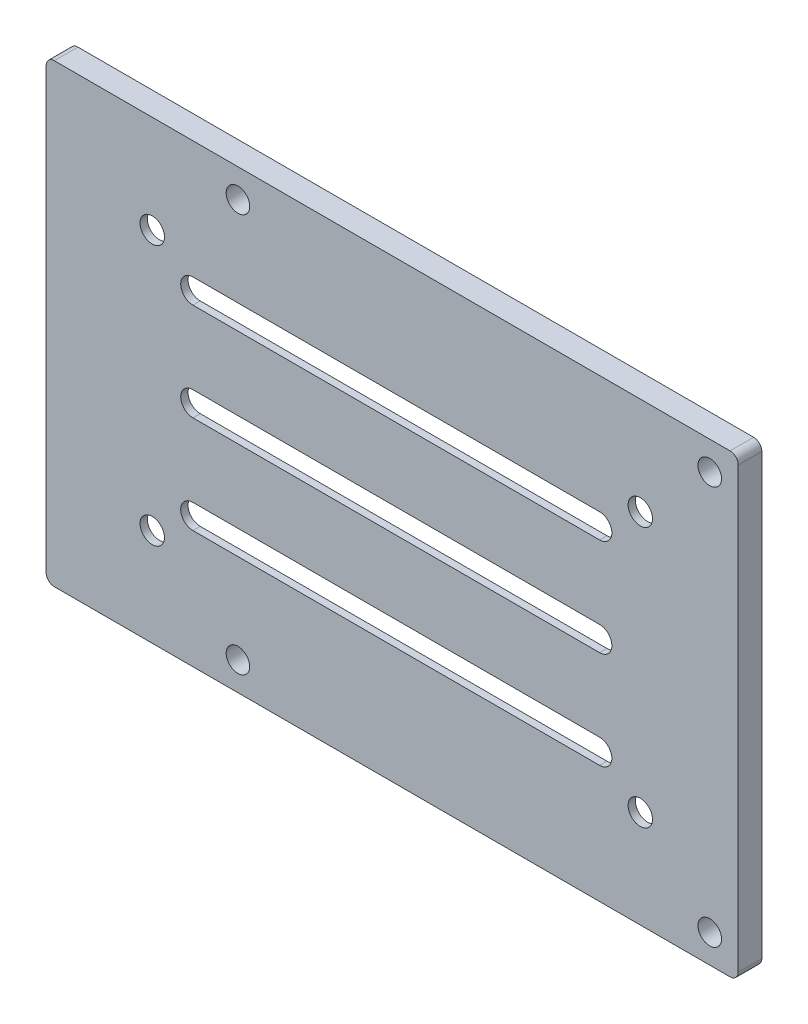
ISO-10303-21;
HEADER;
FILE_DESCRIPTION(('STEP AP214'),'2;1');
FILE_NAME('part.step','',(''),(''),'','','');
FILE_SCHEMA(('AUTOMOTIVE_DESIGN { 1 0 10303 214 1 1 1 1 }'));
ENDSEC;
DATA;
#1=APPLICATION_CONTEXT('core data for automotive mechanical design processes');
#2=APPLICATION_PROTOCOL_DEFINITION('international standard','automotive_design',2000,#1);
#3=PRODUCT_CONTEXT('',#1,'mechanical');
#4=PRODUCT('Part','Part','',(#3));
#5=PRODUCT_RELATED_PRODUCT_CATEGORY('part','',(#4));
#6=PRODUCT_DEFINITION_FORMATION('','',#4);
#7=PRODUCT_DEFINITION_CONTEXT('part definition',#1,'design');
#8=PRODUCT_DEFINITION('design','',#6,#7);
#9=PRODUCT_DEFINITION_SHAPE('','',#8);
#10=(LENGTH_UNIT() NAMED_UNIT(*) SI_UNIT(.MILLI.,.METRE.));
#11=(NAMED_UNIT(*) PLANE_ANGLE_UNIT() SI_UNIT($,.RADIAN.));
#12=(NAMED_UNIT(*) SI_UNIT($,.STERADIAN.) SOLID_ANGLE_UNIT());
#13=UNCERTAINTY_MEASURE_WITH_UNIT(LENGTH_MEASURE(1.E-05),#10,'distance_accuracy_value','');
#14=(GEOMETRIC_REPRESENTATION_CONTEXT(3) GLOBAL_UNCERTAINTY_ASSIGNED_CONTEXT((#13)) GLOBAL_UNIT_ASSIGNED_CONTEXT((#10,
#11,#12)) REPRESENTATION_CONTEXT('',''));
#15=CARTESIAN_POINT('',(0.,0.,0.));
#16=DIRECTION('',(0.,0.,1.));
#17=DIRECTION('',(1.,0.,0.));
#18=AXIS2_PLACEMENT_3D('',#15,#16,#17);
#19=CARTESIAN_POINT('',(0.,0.,2.9));
#20=DIRECTION('',(0.,0.,-1.));
#21=DIRECTION('',(-1.,0.,0.));
#22=AXIS2_PLACEMENT_3D('',#19,#20,#21);
#23=PLANE('',#22);
#24=CARTESIAN_POINT('',(31.,-32.4522728150303,2.9));
#25=DIRECTION('',(0.,0.,-1.));
#26=DIRECTION('',(-1.,0.,0.));
#27=AXIS2_PLACEMENT_3D('',#24,#25,#26);
#28=CIRCLE('',#27,1.5);
#29=CARTESIAN_POINT('',(29.5,-32.4522728150303,2.9));
#30=VERTEX_POINT('',#29);
#31=EDGE_CURVE('E365',#30,#30,#28,.T.);
#32=ORIENTED_EDGE('',*,*,#31,.T.);
#33=EDGE_LOOP('',(#32));
#34=FACE_BOUND('',#33,.T.);
#35=CARTESIAN_POINT('',(-29.,-32.4522728150303,2.9));
#36=DIRECTION('',(0.,0.,-1.));
#37=DIRECTION('',(-1.,0.,0.));
#38=AXIS2_PLACEMENT_3D('',#35,#36,#37);
#39=CIRCLE('',#38,1.5);
#40=CARTESIAN_POINT('',(-30.5,-32.4522728150303,2.9));
#41=VERTEX_POINT('',#40);
#42=EDGE_CURVE('E361',#41,#41,#39,.T.);
#43=ORIENTED_EDGE('',*,*,#42,.T.);
#44=EDGE_LOOP('',(#43));
#45=FACE_BOUND('',#44,.T.);
#46=CARTESIAN_POINT('',(-29.,-0.452272815030259,2.9));
#47=DIRECTION('',(0.,0.,-1.));
#48=DIRECTION('',(-1.,0.,0.));
#49=AXIS2_PLACEMENT_3D('',#46,#47,#48);
#50=CIRCLE('',#49,1.5);
#51=CARTESIAN_POINT('',(-30.5,-0.452272815030259,2.9));
#52=VERTEX_POINT('',#51);
#53=EDGE_CURVE('E357',#52,#52,#50,.T.);
#54=ORIENTED_EDGE('',*,*,#53,.T.);
#55=EDGE_LOOP('',(#54));
#56=FACE_BOUND('',#55,.T.);
#57=DIRECTION('',(1.,0.,0.));
#58=VECTOR('',#57,1.);
#59=CARTESIAN_POINT('',(0.,-2.95227281503026,2.9));
#60=LINE('',#59,#58);
#61=CARTESIAN_POINT('',(-24.,-2.95227281503026,2.9));
#62=VERTEX_POINT('',#61);
#63=CARTESIAN_POINT('',(26.,-2.95227281503026,2.9));
#64=VERTEX_POINT('',#63);
#65=EDGE_CURVE('E349',#62,#64,#60,.T.);
#66=ORIENTED_EDGE('',*,*,#65,.T.);
#67=CARTESIAN_POINT('',(26.,-4.45227281503026,2.9));
#68=DIRECTION('',(0.,0.,-1.));
#69=DIRECTION('',(-1.,0.,0.));
#70=AXIS2_PLACEMENT_3D('',#67,#68,#69);
#71=CIRCLE('',#70,1.5);
#72=CARTESIAN_POINT('',(26.,-5.95227281503026,2.9));
#73=VERTEX_POINT('',#72);
#74=EDGE_CURVE('E353',#64,#73,#71,.T.);
#75=ORIENTED_EDGE('',*,*,#74,.T.);
#76=DIRECTION('',(-1.,0.,0.));
#77=VECTOR('',#76,1.);
#78=CARTESIAN_POINT('',(0.,-5.95227281503026,2.9));
#79=LINE('',#78,#77);
#80=CARTESIAN_POINT('',(-24.,-5.95227281503026,2.9));
#81=VERTEX_POINT('',#80);
#82=EDGE_CURVE('E341',#73,#81,#79,.T.);
#83=ORIENTED_EDGE('',*,*,#82,.T.);
#84=CARTESIAN_POINT('',(-24.,-4.45227281503026,2.9));
#85=DIRECTION('',(0.,0.,-1.));
#86=DIRECTION('',(-1.,0.,0.));
#87=AXIS2_PLACEMENT_3D('',#84,#85,#86);
#88=CIRCLE('',#87,1.5);
#89=EDGE_CURVE('E345',#81,#62,#88,.T.);
#90=ORIENTED_EDGE('',*,*,#89,.T.);
#91=EDGE_LOOP('',(#66,#75,#83,#90));
#92=FACE_BOUND('',#91,.T.);
#93=DIRECTION('',(1.,0.,0.));
#94=VECTOR('',#93,1.);
#95=CARTESIAN_POINT('',(0.,-26.9522728150303,2.9));
#96=LINE('',#95,#94);
#97=CARTESIAN_POINT('',(-24.,-26.9522728150303,2.9));
#98=VERTEX_POINT('',#97);
#99=CARTESIAN_POINT('',(26.,-26.9522728150303,2.9));
#100=VERTEX_POINT('',#99);
#101=EDGE_CURVE('E333',#98,#100,#96,.T.);
#102=ORIENTED_EDGE('',*,*,#101,.T.);
#103=CARTESIAN_POINT('',(26.,-28.4522728150303,2.9));
#104=DIRECTION('',(0.,0.,-1.));
#105=DIRECTION('',(-1.,0.,0.));
#106=AXIS2_PLACEMENT_3D('',#103,#104,#105);
#107=CIRCLE('',#106,1.5);
#108=CARTESIAN_POINT('',(26.,-29.9522728150303,2.9));
#109=VERTEX_POINT('',#108);
#110=EDGE_CURVE('E337',#100,#109,#107,.T.);
#111=ORIENTED_EDGE('',*,*,#110,.T.);
#112=DIRECTION('',(-1.,0.,0.));
#113=VECTOR('',#112,1.);
#114=CARTESIAN_POINT('',(0.,-29.9522728150303,2.9));
#115=LINE('',#114,#113);
#116=CARTESIAN_POINT('',(-24.,-29.9522728150303,2.9));
#117=VERTEX_POINT('',#116);
#118=EDGE_CURVE('E328',#109,#117,#115,.T.);
#119=ORIENTED_EDGE('',*,*,#118,.T.);
#120=CARTESIAN_POINT('',(-24.,-28.4522728150303,2.9));
#121=DIRECTION('',(0.,0.,-1.));
#122=DIRECTION('',(-1.,0.,0.));
#123=AXIS2_PLACEMENT_3D('',#120,#121,#122);
#124=CIRCLE('',#123,1.5);
#125=EDGE_CURVE('E205',#117,#98,#124,.T.);
#126=ORIENTED_EDGE('',*,*,#125,.T.);
#127=EDGE_LOOP('',(#102,#111,#119,#126));
#128=FACE_BOUND('',#127,.T.);
#129=DIRECTION('',(1.,0.,0.));
#130=VECTOR('',#129,1.);
#131=CARTESIAN_POINT('',(0.,-14.9522728150303,2.9));
#132=LINE('',#131,#130);
#133=CARTESIAN_POINT('',(-24.,-14.9522728150303,2.9));
#134=VERTEX_POINT('',#133);
#135=CARTESIAN_POINT('',(26.,-14.9522728150303,2.9));
#136=VERTEX_POINT('',#135);
#137=EDGE_CURVE('E320',#134,#136,#132,.T.);
#138=ORIENTED_EDGE('',*,*,#137,.T.);
#139=CARTESIAN_POINT('',(26.,-16.4522728150303,2.9));
#140=DIRECTION('',(0.,0.,-1.));
#141=DIRECTION('',(-1.,0.,0.));
#142=AXIS2_PLACEMENT_3D('',#139,#140,#141);
#143=CIRCLE('',#142,1.5);
#144=CARTESIAN_POINT('',(26.,-17.9522728150303,2.9));
#145=VERTEX_POINT('',#144);
#146=EDGE_CURVE('E324',#136,#145,#143,.T.);
#147=ORIENTED_EDGE('',*,*,#146,.T.);
#148=DIRECTION('',(-1.,0.,0.));
#149=VECTOR('',#148,1.);
#150=CARTESIAN_POINT('',(0.,-17.9522728150303,2.9));
#151=LINE('',#150,#149);
#152=CARTESIAN_POINT('',(-24.,-17.9522728150303,2.9));
#153=VERTEX_POINT('',#152);
#154=EDGE_CURVE('E312',#145,#153,#151,.T.);
#155=ORIENTED_EDGE('',*,*,#154,.T.);
#156=CARTESIAN_POINT('',(-24.,-16.4522728150303,2.9));
#157=DIRECTION('',(0.,0.,-1.));
#158=DIRECTION('',(-1.,0.,0.));
#159=AXIS2_PLACEMENT_3D('',#156,#157,#158);
#160=CIRCLE('',#159,1.5);
#161=EDGE_CURVE('E316',#153,#134,#160,.T.);
#162=ORIENTED_EDGE('',*,*,#161,.T.);
#163=EDGE_LOOP('',(#138,#147,#155,#162));
#164=FACE_BOUND('',#163,.T.);
#165=CARTESIAN_POINT('',(31.,-0.452272815030259,2.9));
#166=DIRECTION('',(0.,0.,-1.));
#167=DIRECTION('',(-1.,0.,0.));
#168=AXIS2_PLACEMENT_3D('',#165,#166,#167);
#169=CIRCLE('',#168,1.5);
#170=CARTESIAN_POINT('',(29.5,-0.452272815030259,2.9));
#171=VERTEX_POINT('',#170);
#172=EDGE_CURVE('E308',#171,#171,#169,.T.);
#173=ORIENTED_EDGE('',*,*,#172,.T.);
#174=EDGE_LOOP('',(#173));
#175=FACE_BOUND('',#174,.T.);
#176=DIRECTION('',(-1.,0.,0.));
#177=VECTOR('',#176,1.);
#178=CARTESIAN_POINT('',(43.0367463577164,11.5477271849697,2.9));
#179=LINE('',#178,#177);
#180=CARTESIAN_POINT('',(42.0367463577163,11.5477271849697,2.9));
#181=VERTEX_POINT('',#180);
#182=CARTESIAN_POINT('',(-41.0367463577164,11.5477271849697,2.9));
#183=VERTEX_POINT('',#182);
#184=EDGE_CURVE('E459',#181,#183,#179,.T.);
#185=ORIENTED_EDGE('',*,*,#184,.T.);
#186=CARTESIAN_POINT('',(-41.0367463577164,10.5477271849697,2.9));
#187=DIRECTION('',(0.,0.,-1.));
#188=DIRECTION('',(-1.,0.,0.));
#189=AXIS2_PLACEMENT_3D('',#186,#187,#188);
#190=CIRCLE('',#189,1.);
#191=CARTESIAN_POINT('',(-42.0367463577164,10.5477271849697,2.9));
#192=VERTEX_POINT('',#191);
#193=EDGE_CURVE('E512',#183,#192,#190,.F.);
#194=ORIENTED_EDGE('',*,*,#193,.T.);
#195=DIRECTION('',(0.,-1.,0.));
#196=VECTOR('',#195,1.);
#197=CARTESIAN_POINT('',(-42.0367463577164,11.5477271849697,2.9));
#198=LINE('',#197,#196);
#199=CARTESIAN_POINT('',(-42.0367463577163,-43.4522728150303,2.9));
#200=VERTEX_POINT('',#199);
#201=EDGE_CURVE('E446',#192,#200,#198,.T.);
#202=ORIENTED_EDGE('',*,*,#201,.T.);
#203=CARTESIAN_POINT('',(-41.0367463577164,-43.4522728150303,2.9));
#204=DIRECTION('',(0.,0.,-1.));
#205=DIRECTION('',(-1.,0.,0.));
#206=AXIS2_PLACEMENT_3D('',#203,#204,#205);
#207=CIRCLE('',#206,1.);
#208=CARTESIAN_POINT('',(-41.0367463577164,-44.4522728150303,2.9));
#209=VERTEX_POINT('',#208);
#210=EDGE_CURVE('E506',#200,#209,#207,.F.);
#211=ORIENTED_EDGE('',*,*,#210,.T.);
#212=DIRECTION('',(1.,0.,0.));
#213=VECTOR('',#212,1.);
#214=CARTESIAN_POINT('',(43.0367463577164,-44.4522728150303,2.9));
#215=LINE('',#214,#213);
#216=CARTESIAN_POINT('',(42.0367463577164,-44.4522728150303,2.9));
#217=VERTEX_POINT('',#216);
#218=EDGE_CURVE('E450',#209,#217,#215,.T.);
#219=ORIENTED_EDGE('',*,*,#218,.T.);
#220=CARTESIAN_POINT('',(42.0367463577164,-43.4522728150302,2.9));
#221=DIRECTION('',(0.,0.,-1.));
#222=DIRECTION('',(-1.,0.,0.));
#223=AXIS2_PLACEMENT_3D('',#220,#221,#222);
#224=CIRCLE('',#223,1.);
#225=CARTESIAN_POINT('',(43.0367463577164,-43.4522728150302,2.9));
#226=VERTEX_POINT('',#225);
#227=EDGE_CURVE('E503',#217,#226,#224,.F.);
#228=ORIENTED_EDGE('',*,*,#227,.T.);
#229=DIRECTION('',(0.,1.,0.));
#230=VECTOR('',#229,1.);
#231=CARTESIAN_POINT('',(43.0367463577164,11.5477271849697,2.9));
#232=LINE('',#231,#230);
#233=CARTESIAN_POINT('',(43.0367463577164,10.5477271849697,2.9));
#234=VERTEX_POINT('',#233);
#235=EDGE_CURVE('E455',#226,#234,#232,.T.);
#236=ORIENTED_EDGE('',*,*,#235,.T.);
#237=CARTESIAN_POINT('',(42.0367463577163,10.5477271849697,2.9));
#238=DIRECTION('',(0.,0.,-1.));
#239=DIRECTION('',(-1.,0.,0.));
#240=AXIS2_PLACEMENT_3D('',#237,#238,#239);
#241=CIRCLE('',#240,1.);
#242=EDGE_CURVE('E509',#234,#181,#241,.F.);
#243=ORIENTED_EDGE('',*,*,#242,.T.);
#244=EDGE_LOOP('',(#185,#194,#202,#211,#219,#228,#236,#243));
#245=FACE_BOUND('',#244,.T.);
#246=CARTESIAN_POINT('',(39.5367463577164,8.04772718496975,2.9));
#247=DIRECTION('',(0.,0.,1.));
#248=DIRECTION('',(1.,0.,0.));
#249=AXIS2_PLACEMENT_3D('',#246,#247,#248);
#250=CIRCLE('',#249,1.45);
#251=CARTESIAN_POINT('',(40.9867463577164,8.04772718496975,2.9));
#252=VERTEX_POINT('',#251);
#253=EDGE_CURVE('E438',#252,#252,#250,.T.);
#254=ORIENTED_EDGE('',*,*,#253,.F.);
#255=EDGE_LOOP('',(#254));
#256=FACE_BOUND('',#255,.T.);
#257=CARTESIAN_POINT('',(39.5367463577164,-40.9522728150302,2.9));
#258=DIRECTION('',(0.,0.,1.));
#259=DIRECTION('',(1.,0.,0.));
#260=AXIS2_PLACEMENT_3D('',#257,#258,#259);
#261=CIRCLE('',#260,1.44999999999999);
#262=CARTESIAN_POINT('',(40.9867463577164,-40.9522728150302,2.9));
#263=VERTEX_POINT('',#262);
#264=EDGE_CURVE('E430',#263,#263,#261,.T.);
#265=ORIENTED_EDGE('',*,*,#264,.F.);
#266=EDGE_LOOP('',(#265));
#267=FACE_BOUND('',#266,.T.);
#268=CARTESIAN_POINT('',(-18.4632536422836,8.04772718496975,2.9));
#269=DIRECTION('',(0.,0.,1.));
#270=DIRECTION('',(1.,0.,0.));
#271=AXIS2_PLACEMENT_3D('',#268,#269,#270);
#272=CIRCLE('',#271,1.45);
#273=CARTESIAN_POINT('',(-17.0132536422836,8.04772718496975,2.9));
#274=VERTEX_POINT('',#273);
#275=EDGE_CURVE('E422',#274,#274,#272,.T.);
#276=ORIENTED_EDGE('',*,*,#275,.F.);
#277=EDGE_LOOP('',(#276));
#278=FACE_BOUND('',#277,.T.);
#279=CARTESIAN_POINT('',(-18.4632536422836,-40.9522728150303,2.9));
#280=DIRECTION('',(0.,0.,1.));
#281=DIRECTION('',(1.,0.,0.));
#282=AXIS2_PLACEMENT_3D('',#279,#280,#281);
#283=CIRCLE('',#282,1.44443988291442);
#284=CARTESIAN_POINT('',(-17.0188137593692,-40.9522728150303,2.9));
#285=VERTEX_POINT('',#284);
#286=EDGE_CURVE('E414',#285,#285,#283,.T.);
#287=ORIENTED_EDGE('',*,*,#286,.F.);
#288=EDGE_LOOP('',(#287));
#289=FACE_BOUND('',#288,.T.);
#290=ADVANCED_FACE('F38',(#34,#45,#56,#92,#128,#164,#175,#245,#256,#267,#278,#289),#23,.F.);
#291=CARTESIAN_POINT('',(0.,0.,0.));
#292=DIRECTION('',(0.,0.,-1.));
#293=DIRECTION('',(-1.,0.,0.));
#294=AXIS2_PLACEMENT_3D('',#291,#292,#293);
#295=PLANE('',#294);
#296=DIRECTION('',(0.,-1.,0.));
#297=VECTOR('',#296,1.);
#298=CARTESIAN_POINT('',(38.0367463577164,4.54772718496975,0.));
#299=LINE('',#298,#297);
#300=CARTESIAN_POINT('',(38.0367463577164,4.54772718496975,0.));
#301=VERTEX_POINT('',#300);
#302=CARTESIAN_POINT('',(38.0367463577164,-37.4522728150303,0.));
#303=VERTEX_POINT('',#302);
#304=EDGE_CURVE('E369',#301,#303,#299,.T.);
#305=ORIENTED_EDGE('',*,*,#304,.F.);
#306=DIRECTION('',(1.,0.,0.));
#307=VECTOR('',#306,1.);
#308=CARTESIAN_POINT('',(38.0367463577164,4.54772718496975,0.));
#309=LINE('',#308,#307);
#310=CARTESIAN_POINT('',(-36.0367463577164,4.54772718496975,0.));
#311=VERTEX_POINT('',#310);
#312=EDGE_CURVE('E375',#311,#301,#309,.T.);
#313=ORIENTED_EDGE('',*,*,#312,.F.);
#314=DIRECTION('',(0.,1.,0.));
#315=VECTOR('',#314,1.);
#316=CARTESIAN_POINT('',(-36.0367463577164,4.54772718496975,0.));
#317=LINE('',#316,#315);
#318=CARTESIAN_POINT('',(-36.0367463577164,-37.4522728150303,0.));
#319=VERTEX_POINT('',#318);
#320=EDGE_CURVE('E394',#319,#311,#317,.T.);
#321=ORIENTED_EDGE('',*,*,#320,.F.);
#322=DIRECTION('',(-1.,0.,0.));
#323=VECTOR('',#322,1.);
#324=CARTESIAN_POINT('',(38.0367463577164,-37.4522728150303,0.));
#325=LINE('',#324,#323);
#326=EDGE_CURVE('E390',#303,#319,#325,.T.);
#327=ORIENTED_EDGE('',*,*,#326,.F.);
#328=EDGE_LOOP('',(#305,#313,#321,#327));
#329=FACE_BOUND('',#328,.T.);
#330=CARTESIAN_POINT('',(-18.4632536422836,8.04772718496975,0.));
#331=DIRECTION('',(0.,0.,1.));
#332=DIRECTION('',(1.,0.,0.));
#333=AXIS2_PLACEMENT_3D('',#330,#331,#332);
#334=CIRCLE('',#333,1.45);
#335=CARTESIAN_POINT('',(-17.0132536422836,8.04772718496975,0.));
#336=VERTEX_POINT('',#335);
#337=EDGE_CURVE('E418',#336,#336,#334,.T.);
#338=ORIENTED_EDGE('',*,*,#337,.T.);
#339=EDGE_LOOP('',(#338));
#340=FACE_BOUND('',#339,.T.);
#341=CARTESIAN_POINT('',(39.5367463577164,8.04772718496975,0.));
#342=DIRECTION('',(0.,0.,1.));
#343=DIRECTION('',(1.,0.,0.));
#344=AXIS2_PLACEMENT_3D('',#341,#342,#343);
#345=CIRCLE('',#344,1.45);
#346=CARTESIAN_POINT('',(40.9867463577164,8.04772718496975,0.));
#347=VERTEX_POINT('',#346);
#348=EDGE_CURVE('E434',#347,#347,#345,.T.);
#349=ORIENTED_EDGE('',*,*,#348,.T.);
#350=EDGE_LOOP('',(#349));
#351=FACE_BOUND('',#350,.T.);
#352=DIRECTION('',(0.,-1.,0.));
#353=VECTOR('',#352,1.);
#354=CARTESIAN_POINT('',(-42.0367463577164,11.5477271849697,0.));
#355=LINE('',#354,#353);
#356=CARTESIAN_POINT('',(-42.0367463577164,10.5477271849697,0.));
#357=VERTEX_POINT('',#356);
#358=CARTESIAN_POINT('',(-42.0367463577163,-43.4522728150303,0.));
#359=VERTEX_POINT('',#358);
#360=EDGE_CURVE('E442',#357,#359,#355,.T.);
#361=ORIENTED_EDGE('',*,*,#360,.F.);
#362=CARTESIAN_POINT('',(-41.0367463577164,10.5477271849697,0.));
#363=DIRECTION('',(0.,0.,-1.));
#364=DIRECTION('',(-1.,0.,0.));
#365=AXIS2_PLACEMENT_3D('',#362,#363,#364);
#366=CIRCLE('',#365,1.);
#367=CARTESIAN_POINT('',(-41.0367463577164,11.5477271849697,0.));
#368=VERTEX_POINT('',#367);
#369=EDGE_CURVE('E493',#357,#368,#366,.T.);
#370=ORIENTED_EDGE('',*,*,#369,.T.);
#371=DIRECTION('',(-1.,0.,0.));
#372=VECTOR('',#371,1.);
#373=CARTESIAN_POINT('',(43.0367463577164,11.5477271849697,0.));
#374=LINE('',#373,#372);
#375=CARTESIAN_POINT('',(42.0367463577163,11.5477271849697,0.));
#376=VERTEX_POINT('',#375);
#377=EDGE_CURVE('E451',#376,#368,#374,.T.);
#378=ORIENTED_EDGE('',*,*,#377,.F.);
#379=CARTESIAN_POINT('',(42.0367463577163,10.5477271849697,0.));
#380=DIRECTION('',(0.,0.,-1.));
#381=DIRECTION('',(-1.,0.,0.));
#382=AXIS2_PLACEMENT_3D('',#379,#380,#381);
#383=CIRCLE('',#382,1.);
#384=CARTESIAN_POINT('',(43.0367463577164,10.5477271849697,0.));
#385=VERTEX_POINT('',#384);
#386=EDGE_CURVE('E490',#376,#385,#383,.T.);
#387=ORIENTED_EDGE('',*,*,#386,.T.);
#388=DIRECTION('',(0.,1.,0.));
#389=VECTOR('',#388,1.);
#390=CARTESIAN_POINT('',(43.0367463577164,11.5477271849697,0.));
#391=LINE('',#390,#389);
#392=CARTESIAN_POINT('',(43.0367463577164,-43.4522728150302,0.));
#393=VERTEX_POINT('',#392);
#394=EDGE_CURVE('E471',#393,#385,#391,.T.);
#395=ORIENTED_EDGE('',*,*,#394,.F.);
#396=CARTESIAN_POINT('',(42.0367463577164,-43.4522728150302,0.));
#397=DIRECTION('',(0.,0.,-1.));
#398=DIRECTION('',(-1.,0.,0.));
#399=AXIS2_PLACEMENT_3D('',#396,#397,#398);
#400=CIRCLE('',#399,1.);
#401=CARTESIAN_POINT('',(42.0367463577164,-44.4522728150303,0.));
#402=VERTEX_POINT('',#401);
#403=EDGE_CURVE('E484',#393,#402,#400,.T.);
#404=ORIENTED_EDGE('',*,*,#403,.T.);
#405=DIRECTION('',(1.,0.,0.));
#406=VECTOR('',#405,1.);
#407=CARTESIAN_POINT('',(43.0367463577164,-44.4522728150303,0.));
#408=LINE('',#407,#406);
#409=CARTESIAN_POINT('',(-41.0367463577164,-44.4522728150303,0.));
#410=VERTEX_POINT('',#409);
#411=EDGE_CURVE('E467',#410,#402,#408,.T.);
#412=ORIENTED_EDGE('',*,*,#411,.F.);
#413=CARTESIAN_POINT('',(-41.0367463577164,-43.4522728150303,0.));
#414=DIRECTION('',(0.,0.,-1.));
#415=DIRECTION('',(-1.,0.,0.));
#416=AXIS2_PLACEMENT_3D('',#413,#414,#415);
#417=CIRCLE('',#416,1.);
#418=EDGE_CURVE('E487',#410,#359,#417,.T.);
#419=ORIENTED_EDGE('',*,*,#418,.T.);
#420=EDGE_LOOP('',(#361,#370,#378,#387,#395,#404,#412,#419));
#421=FACE_BOUND('',#420,.T.);
#422=CARTESIAN_POINT('',(39.5367463577164,-40.9522728150302,0.));
#423=DIRECTION('',(0.,0.,1.));
#424=DIRECTION('',(1.,0.,0.));
#425=AXIS2_PLACEMENT_3D('',#422,#423,#424);
#426=CIRCLE('',#425,1.44999999999999);
#427=CARTESIAN_POINT('',(40.9867463577164,-40.9522728150302,0.));
#428=VERTEX_POINT('',#427);
#429=EDGE_CURVE('E426',#428,#428,#426,.T.);
#430=ORIENTED_EDGE('',*,*,#429,.T.);
#431=EDGE_LOOP('',(#430));
#432=FACE_BOUND('',#431,.T.);
#433=CARTESIAN_POINT('',(-18.4632536422836,-40.9522728150303,0.));
#434=DIRECTION('',(0.,0.,1.));
#435=DIRECTION('',(1.,0.,0.));
#436=AXIS2_PLACEMENT_3D('',#433,#434,#435);
#437=CIRCLE('',#436,1.44443988291442);
#438=CARTESIAN_POINT('',(-17.0188137593692,-40.9522728150303,0.));
#439=VERTEX_POINT('',#438);
#440=EDGE_CURVE('E404',#439,#439,#437,.T.);
#441=ORIENTED_EDGE('',*,*,#440,.T.);
#442=EDGE_LOOP('',(#441));
#443=FACE_BOUND('',#442,.T.);
#444=ADVANCED_FACE('F541',(#329,#340,#351,#421,#432,#443),#295,.T.);
#445=CARTESIAN_POINT('',(-42.0367463577164,11.5477271849697,2.9));
#446=DIRECTION('',(1.,0.,0.));
#447=DIRECTION('',(0.,1.,0.));
#448=AXIS2_PLACEMENT_3D('',#445,#446,#447);
#449=PLANE('',#448);
#450=ORIENTED_EDGE('',*,*,#201,.F.);
#451=DIRECTION('',(0.,0.,-1.));
#452=VECTOR('',#451,1.);
#453=CARTESIAN_POINT('',(-42.0367463577164,10.5477271849697,2.9));
#454=LINE('',#453,#452);
#455=EDGE_CURVE('E480',#192,#357,#454,.T.);
#456=ORIENTED_EDGE('',*,*,#455,.T.);
#457=ORIENTED_EDGE('',*,*,#360,.T.);
#458=DIRECTION('',(0.,0.,-1.));
#459=VECTOR('',#458,1.);
#460=CARTESIAN_POINT('',(-42.0367463577163,-43.4522728150303,2.9));
#461=LINE('',#460,#459);
#462=EDGE_CURVE('E463',#359,#200,#461,.F.);
#463=ORIENTED_EDGE('',*,*,#462,.T.);
#464=EDGE_LOOP('',(#450,#456,#457,#463));
#465=FACE_BOUND('',#464,.T.);
#466=ADVANCED_FACE('F558',(#465),#449,.F.);
#467=CARTESIAN_POINT('',(43.0367463577164,-44.4522728150303,2.9));
#468=DIRECTION('',(0.,1.,0.));
#469=DIRECTION('',(-1.,0.,0.));
#470=AXIS2_PLACEMENT_3D('',#467,#468,#469);
#471=PLANE('',#470);
#472=ORIENTED_EDGE('',*,*,#218,.F.);
#473=DIRECTION('',(0.,0.,-1.));
#474=VECTOR('',#473,1.);
#475=CARTESIAN_POINT('',(-41.0367463577164,-44.4522728150303,2.9));
#476=LINE('',#475,#474);
#477=EDGE_CURVE('E11',#209,#410,#476,.T.);
#478=ORIENTED_EDGE('',*,*,#477,.T.);
#479=ORIENTED_EDGE('',*,*,#411,.T.);
#480=DIRECTION('',(0.,0.,-1.));
#481=VECTOR('',#480,1.);
#482=CARTESIAN_POINT('',(42.0367463577164,-44.4522728150303,2.9));
#483=LINE('',#482,#481);
#484=EDGE_CURVE('E47',#402,#217,#483,.F.);
#485=ORIENTED_EDGE('',*,*,#484,.T.);
#486=EDGE_LOOP('',(#472,#478,#479,#485));
#487=FACE_BOUND('',#486,.T.);
#488=ADVANCED_FACE('F525',(#487),#471,.F.);
#489=CARTESIAN_POINT('',(43.0367463577164,11.5477271849697,2.9));
#490=DIRECTION('',(-1.,0.,0.));
#491=DIRECTION('',(0.,-1.,0.));
#492=AXIS2_PLACEMENT_3D('',#489,#490,#491);
#493=PLANE('',#492);
#494=ORIENTED_EDGE('',*,*,#394,.T.);
#495=DIRECTION('',(0.,0.,-1.));
#496=VECTOR('',#495,1.);
#497=CARTESIAN_POINT('',(43.0367463577164,10.5477271849697,2.9));
#498=LINE('',#497,#496);
#499=EDGE_CURVE('E519',#385,#234,#498,.F.);
#500=ORIENTED_EDGE('',*,*,#499,.T.);
#501=ORIENTED_EDGE('',*,*,#235,.F.);
#502=DIRECTION('',(0.,0.,-1.));
#503=VECTOR('',#502,1.);
#504=CARTESIAN_POINT('',(43.0367463577164,-43.4522728150302,2.9));
#505=LINE('',#504,#503);
#506=EDGE_CURVE('E515',#226,#393,#505,.T.);
#507=ORIENTED_EDGE('',*,*,#506,.T.);
#508=EDGE_LOOP('',(#494,#500,#501,#507));
#509=FACE_BOUND('',#508,.T.);
#510=ADVANCED_FACE('F537',(#509),#493,.F.);
#511=CARTESIAN_POINT('',(43.0367463577164,11.5477271849697,2.9));
#512=DIRECTION('',(0.,-1.,0.));
#513=DIRECTION('',(1.,0.,0.));
#514=AXIS2_PLACEMENT_3D('',#511,#512,#513);
#515=PLANE('',#514);
#516=ORIENTED_EDGE('',*,*,#377,.T.);
#517=DIRECTION('',(0.,0.,-1.));
#518=VECTOR('',#517,1.);
#519=CARTESIAN_POINT('',(-41.0367463577164,11.5477271849697,2.9));
#520=LINE('',#519,#518);
#521=EDGE_CURVE('E500',#368,#183,#520,.F.);
#522=ORIENTED_EDGE('',*,*,#521,.T.);
#523=ORIENTED_EDGE('',*,*,#184,.F.);
#524=DIRECTION('',(0.,0.,-1.));
#525=VECTOR('',#524,1.);
#526=CARTESIAN_POINT('',(42.0367463577163,11.5477271849697,2.9));
#527=LINE('',#526,#525);
#528=EDGE_CURVE('E496',#181,#376,#527,.T.);
#529=ORIENTED_EDGE('',*,*,#528,.T.);
#530=EDGE_LOOP('',(#516,#522,#523,#529));
#531=FACE_BOUND('',#530,.T.);
#532=ADVANCED_FACE('F550',(#531),#515,.F.);
#533=CARTESIAN_POINT('',(39.5367463577164,8.04772718496975,2.9));
#534=DIRECTION('',(0.,0.,-1.));
#535=DIRECTION('',(-1.,0.,0.));
#536=AXIS2_PLACEMENT_3D('',#533,#534,#535);
#537=CYLINDRICAL_SURFACE('',#536,1.45);
#538=ORIENTED_EDGE('',*,*,#253,.T.);
#539=EDGE_LOOP('',(#538));
#540=FACE_BOUND('',#539,.T.);
#541=ORIENTED_EDGE('',*,*,#348,.F.);
#542=EDGE_LOOP('',(#541));
#543=FACE_BOUND('',#542,.T.);
#544=ADVANCED_FACE('F579',(#540,#543),#537,.F.);
#545=CARTESIAN_POINT('',(39.5367463577164,-40.9522728150302,2.9));
#546=DIRECTION('',(0.,0.,-1.));
#547=DIRECTION('',(-1.,0.,0.));
#548=AXIS2_PLACEMENT_3D('',#545,#546,#547);
#549=CYLINDRICAL_SURFACE('',#548,1.44999999999999);
#550=ORIENTED_EDGE('',*,*,#264,.T.);
#551=EDGE_LOOP('',(#550));
#552=FACE_BOUND('',#551,.T.);
#553=ORIENTED_EDGE('',*,*,#429,.F.);
#554=EDGE_LOOP('',(#553));
#555=FACE_BOUND('',#554,.T.);
#556=ADVANCED_FACE('F601',(#552,#555),#549,.F.);
#557=CARTESIAN_POINT('',(-18.4632536422836,8.04772718496975,2.9));
#558=DIRECTION('',(0.,0.,-1.));
#559=DIRECTION('',(-1.,0.,0.));
#560=AXIS2_PLACEMENT_3D('',#557,#558,#559);
#561=CYLINDRICAL_SURFACE('',#560,1.45);
#562=ORIENTED_EDGE('',*,*,#275,.T.);
#563=EDGE_LOOP('',(#562));
#564=FACE_BOUND('',#563,.T.);
#565=ORIENTED_EDGE('',*,*,#337,.F.);
#566=EDGE_LOOP('',(#565));
#567=FACE_BOUND('',#566,.T.);
#568=ADVANCED_FACE('F595',(#564,#567),#561,.F.);
#569=CARTESIAN_POINT('',(-18.4632536422836,-40.9522728150303,2.9));
#570=DIRECTION('',(0.,0.,-1.));
#571=DIRECTION('',(-1.,0.,0.));
#572=AXIS2_PLACEMENT_3D('',#569,#570,#571);
#573=CYLINDRICAL_SURFACE('',#572,1.44443988291442);
#574=ORIENTED_EDGE('',*,*,#286,.T.);
#575=EDGE_LOOP('',(#574));
#576=FACE_BOUND('',#575,.T.);
#577=ORIENTED_EDGE('',*,*,#440,.F.);
#578=EDGE_LOOP('',(#577));
#579=FACE_BOUND('',#578,.T.);
#580=ADVANCED_FACE('F591',(#576,#579),#573,.F.);
#581=CARTESIAN_POINT('',(-41.0367463577164,10.5477271849697,2.9));
#582=DIRECTION('',(0.,0.,-1.));
#583=DIRECTION('',(-1.,0.,0.));
#584=AXIS2_PLACEMENT_3D('',#581,#582,#583);
#585=CYLINDRICAL_SURFACE('',#584,1.);
#586=ORIENTED_EDGE('',*,*,#193,.F.);
#587=ORIENTED_EDGE('',*,*,#521,.F.);
#588=ORIENTED_EDGE('',*,*,#369,.F.);
#589=ORIENTED_EDGE('',*,*,#455,.F.);
#590=EDGE_LOOP('',(#586,#587,#588,#589));
#591=FACE_BOUND('',#590,.T.);
#592=ADVANCED_FACE('F556',(#591),#585,.T.);
#593=CARTESIAN_POINT('',(42.0367463577163,10.5477271849697,2.9));
#594=DIRECTION('',(0.,0.,-1.));
#595=DIRECTION('',(-1.,0.,0.));
#596=AXIS2_PLACEMENT_3D('',#593,#594,#595);
#597=CYLINDRICAL_SURFACE('',#596,1.);
#598=ORIENTED_EDGE('',*,*,#242,.F.);
#599=ORIENTED_EDGE('',*,*,#499,.F.);
#600=ORIENTED_EDGE('',*,*,#386,.F.);
#601=ORIENTED_EDGE('',*,*,#528,.F.);
#602=EDGE_LOOP('',(#598,#599,#600,#601));
#603=FACE_BOUND('',#602,.T.);
#604=ADVANCED_FACE('F547',(#603),#597,.T.);
#605=CARTESIAN_POINT('',(-41.0367463577164,-43.4522728150303,2.9));
#606=DIRECTION('',(0.,0.,-1.));
#607=DIRECTION('',(-1.,0.,0.));
#608=AXIS2_PLACEMENT_3D('',#605,#606,#607);
#609=CYLINDRICAL_SURFACE('',#608,1.);
#610=ORIENTED_EDGE('',*,*,#210,.F.);
#611=ORIENTED_EDGE('',*,*,#462,.F.);
#612=ORIENTED_EDGE('',*,*,#418,.F.);
#613=ORIENTED_EDGE('',*,*,#477,.F.);
#614=EDGE_LOOP('',(#610,#611,#612,#613));
#615=FACE_BOUND('',#614,.T.);
#616=ADVANCED_FACE('F561',(#615),#609,.T.);
#617=CARTESIAN_POINT('',(42.0367463577164,-43.4522728150302,2.9));
#618=DIRECTION('',(0.,0.,-1.));
#619=DIRECTION('',(-1.,0.,0.));
#620=AXIS2_PLACEMENT_3D('',#617,#618,#619);
#621=CYLINDRICAL_SURFACE('',#620,1.);
#622=ORIENTED_EDGE('',*,*,#227,.F.);
#623=ORIENTED_EDGE('',*,*,#484,.F.);
#624=ORIENTED_EDGE('',*,*,#403,.F.);
#625=ORIENTED_EDGE('',*,*,#506,.F.);
#626=EDGE_LOOP('',(#622,#623,#624,#625));
#627=FACE_BOUND('',#626,.T.);
#628=ADVANCED_FACE('F40',(#627),#621,.T.);
#629=CARTESIAN_POINT('',(38.0367463577164,4.54772718496975,2.));
#630=DIRECTION('',(1.,0.,0.));
#631=DIRECTION('',(0.,1.,0.));
#632=AXIS2_PLACEMENT_3D('',#629,#630,#631);
#633=PLANE('',#632);
#634=ORIENTED_EDGE('',*,*,#304,.T.);
#635=DIRECTION('',(0.,0.,-1.));
#636=VECTOR('',#635,1.);
#637=CARTESIAN_POINT('',(38.0367463577164,-37.4522728150303,2.));
#638=LINE('',#637,#636);
#639=CARTESIAN_POINT('',(38.0367463577164,-37.4522728150303,2.));
#640=VERTEX_POINT('',#639);
#641=EDGE_CURVE('E387',#640,#303,#638,.T.);
#642=ORIENTED_EDGE('',*,*,#641,.F.);
#643=DIRECTION('',(0.,-1.,0.));
#644=VECTOR('',#643,1.);
#645=CARTESIAN_POINT('',(38.0367463577164,4.54772718496975,2.));
#646=LINE('',#645,#644);
#647=CARTESIAN_POINT('',(38.0367463577164,4.54772718496975,2.));
#648=VERTEX_POINT('',#647);
#649=EDGE_CURVE('E370',#648,#640,#646,.T.);
#650=ORIENTED_EDGE('',*,*,#649,.F.);
#651=DIRECTION('',(0.,0.,-1.));
#652=VECTOR('',#651,1.);
#653=CARTESIAN_POINT('',(38.0367463577164,4.54772718496975,2.));
#654=LINE('',#653,#652);
#655=EDGE_CURVE('E401',#648,#301,#654,.T.);
#656=ORIENTED_EDGE('',*,*,#655,.T.);
#657=EDGE_LOOP('',(#634,#642,#650,#656));
#658=FACE_BOUND('',#657,.T.);
#659=ADVANCED_FACE('F567',(#658),#633,.F.);
#660=CARTESIAN_POINT('',(38.0367463577164,4.54772718496975,2.));
#661=DIRECTION('',(0.,1.,0.));
#662=DIRECTION('',(0.,0.,1.));
#663=AXIS2_PLACEMENT_3D('',#660,#661,#662);
#664=PLANE('',#663);
#665=ORIENTED_EDGE('',*,*,#312,.T.);
#666=ORIENTED_EDGE('',*,*,#655,.F.);
#667=DIRECTION('',(1.,0.,0.));
#668=VECTOR('',#667,1.);
#669=CARTESIAN_POINT('',(38.0367463577164,4.54772718496975,2.));
#670=LINE('',#669,#668);
#671=CARTESIAN_POINT('',(-36.0367463577164,4.54772718496975,2.));
#672=VERTEX_POINT('',#671);
#673=EDGE_CURVE('E383',#672,#648,#670,.T.);
#674=ORIENTED_EDGE('',*,*,#673,.F.);
#675=DIRECTION('',(0.,0.,-1.));
#676=VECTOR('',#675,1.);
#677=CARTESIAN_POINT('',(-36.0367463577164,4.54772718496975,2.));
#678=LINE('',#677,#676);
#679=EDGE_CURVE('E405',#672,#311,#678,.T.);
#680=ORIENTED_EDGE('',*,*,#679,.T.);
#681=EDGE_LOOP('',(#665,#666,#674,#680));
#682=FACE_BOUND('',#681,.T.);
#683=ADVANCED_FACE('F665',(#682),#664,.F.);
#684=CARTESIAN_POINT('',(-36.0367463577164,4.54772718496975,2.));
#685=DIRECTION('',(-1.,0.,0.));
#686=DIRECTION('',(0.,0.,1.));
#687=AXIS2_PLACEMENT_3D('',#684,#685,#686);
#688=PLANE('',#687);
#689=ORIENTED_EDGE('',*,*,#320,.T.);
#690=ORIENTED_EDGE('',*,*,#679,.F.);
#691=DIRECTION('',(0.,1.,0.));
#692=VECTOR('',#691,1.);
#693=CARTESIAN_POINT('',(-36.0367463577164,4.54772718496975,2.));
#694=LINE('',#693,#692);
#695=CARTESIAN_POINT('',(-36.0367463577164,-37.4522728150303,2.));
#696=VERTEX_POINT('',#695);
#697=EDGE_CURVE('E379',#696,#672,#694,.T.);
#698=ORIENTED_EDGE('',*,*,#697,.F.);
#699=DIRECTION('',(0.,0.,-1.));
#700=VECTOR('',#699,1.);
#701=CARTESIAN_POINT('',(-36.0367463577164,-37.4522728150303,2.));
#702=LINE('',#701,#700);
#703=EDGE_CURVE('E408',#696,#319,#702,.T.);
#704=ORIENTED_EDGE('',*,*,#703,.T.);
#705=EDGE_LOOP('',(#689,#690,#698,#704));
#706=FACE_BOUND('',#705,.T.);
#707=ADVANCED_FACE('F674',(#706),#688,.F.);
#708=CARTESIAN_POINT('',(38.0367463577164,-37.4522728150303,2.));
#709=DIRECTION('',(0.,-1.,0.));
#710=DIRECTION('',(0.,0.,-1.));
#711=AXIS2_PLACEMENT_3D('',#708,#709,#710);
#712=PLANE('',#711);
#713=ORIENTED_EDGE('',*,*,#326,.T.);
#714=ORIENTED_EDGE('',*,*,#703,.F.);
#715=DIRECTION('',(-1.,0.,0.));
#716=VECTOR('',#715,1.);
#717=CARTESIAN_POINT('',(38.0367463577164,-37.4522728150303,2.));
#718=LINE('',#717,#716);
#719=EDGE_CURVE('E374',#640,#696,#718,.T.);
#720=ORIENTED_EDGE('',*,*,#719,.F.);
#721=ORIENTED_EDGE('',*,*,#641,.T.);
#722=EDGE_LOOP('',(#713,#714,#720,#721));
#723=FACE_BOUND('',#722,.T.);
#724=ADVANCED_FACE('F684',(#723),#712,.F.);
#725=CARTESIAN_POINT('',(0.,0.,2.));
#726=DIRECTION('',(0.,0.,-1.));
#727=DIRECTION('',(-1.,0.,0.));
#728=AXIS2_PLACEMENT_3D('',#725,#726,#727);
#729=PLANE('',#728);
#730=CARTESIAN_POINT('',(31.,-32.4522728150303,2.));
#731=DIRECTION('',(0.,0.,-1.));
#732=DIRECTION('',(1.,0.,0.));
#733=AXIS2_PLACEMENT_3D('',#730,#731,#732);
#734=CIRCLE('',#733,1.5);
#735=CARTESIAN_POINT('',(32.5,-32.4522728150303,2.));
#736=VERTEX_POINT('',#735);
#737=EDGE_CURVE('E267',#736,#736,#734,.T.);
#738=ORIENTED_EDGE('',*,*,#737,.F.);
#739=EDGE_LOOP('',(#738));
#740=FACE_BOUND('',#739,.T.);
#741=CARTESIAN_POINT('',(-29.,-32.4522728150303,2.));
#742=DIRECTION('',(0.,0.,-1.));
#743=DIRECTION('',(-1.,0.,0.));
#744=AXIS2_PLACEMENT_3D('',#741,#742,#743);
#745=CIRCLE('',#744,1.5);
#746=CARTESIAN_POINT('',(-30.5,-32.4522728150303,2.));
#747=VERTEX_POINT('',#746);
#748=EDGE_CURVE('E272',#747,#747,#745,.T.);
#749=ORIENTED_EDGE('',*,*,#748,.F.);
#750=EDGE_LOOP('',(#749));
#751=FACE_BOUND('',#750,.T.);
#752=CARTESIAN_POINT('',(-29.,-0.452272815030259,2.));
#753=DIRECTION('',(0.,0.,-1.));
#754=DIRECTION('',(1.,0.,0.));
#755=AXIS2_PLACEMENT_3D('',#752,#753,#754);
#756=CIRCLE('',#755,1.5);
#757=CARTESIAN_POINT('',(-27.5,-0.452272815030259,2.));
#758=VERTEX_POINT('',#757);
#759=EDGE_CURVE('E276',#758,#758,#756,.T.);
#760=ORIENTED_EDGE('',*,*,#759,.F.);
#761=EDGE_LOOP('',(#760));
#762=FACE_BOUND('',#761,.T.);
#763=CARTESIAN_POINT('',(26.,-4.45227281503026,2.));
#764=DIRECTION('',(0.,0.,-1.));
#765=DIRECTION('',(-1.,0.,0.));
#766=AXIS2_PLACEMENT_3D('',#763,#764,#765);
#767=CIRCLE('',#766,1.5);
#768=CARTESIAN_POINT('',(26.,-2.95227281503026,2.));
#769=VERTEX_POINT('',#768);
#770=CARTESIAN_POINT('',(26.,-5.95227281503026,2.));
#771=VERTEX_POINT('',#770);
#772=EDGE_CURVE('E234',#769,#771,#767,.T.);
#773=ORIENTED_EDGE('',*,*,#772,.F.);
#774=DIRECTION('',(1.,0.,0.));
#775=VECTOR('',#774,1.);
#776=CARTESIAN_POINT('',(26.,-2.95227281503026,2.));
#777=LINE('',#776,#775);
#778=CARTESIAN_POINT('',(-24.,-2.95227281503026,2.));
#779=VERTEX_POINT('',#778);
#780=EDGE_CURVE('E290',#779,#769,#777,.T.);
#781=ORIENTED_EDGE('',*,*,#780,.F.);
#782=CARTESIAN_POINT('',(-24.,-4.45227281503026,2.));
#783=DIRECTION('',(0.,0.,-1.));
#784=DIRECTION('',(-1.,0.,0.));
#785=AXIS2_PLACEMENT_3D('',#782,#783,#784);
#786=CIRCLE('',#785,1.5);
#787=CARTESIAN_POINT('',(-24.,-5.95227281503026,2.));
#788=VERTEX_POINT('',#787);
#789=EDGE_CURVE('E286',#788,#779,#786,.T.);
#790=ORIENTED_EDGE('',*,*,#789,.F.);
#791=DIRECTION('',(-1.,0.,0.));
#792=VECTOR('',#791,1.);
#793=CARTESIAN_POINT('',(26.,-5.95227281503026,2.));
#794=LINE('',#793,#792);
#795=EDGE_CURVE('E283',#771,#788,#794,.T.);
#796=ORIENTED_EDGE('',*,*,#795,.F.);
#797=EDGE_LOOP('',(#773,#781,#790,#796));
#798=FACE_BOUND('',#797,.T.);
#799=CARTESIAN_POINT('',(26.,-28.4522728150303,2.));
#800=DIRECTION('',(0.,0.,-1.));
#801=DIRECTION('',(1.,0.,0.));
#802=AXIS2_PLACEMENT_3D('',#799,#800,#801);
#803=CIRCLE('',#802,1.5);
#804=CARTESIAN_POINT('',(26.,-26.9522728150303,2.));
#805=VERTEX_POINT('',#804);
#806=CARTESIAN_POINT('',(26.,-29.9522728150303,2.));
#807=VERTEX_POINT('',#806);
#808=EDGE_CURVE('E219',#805,#807,#803,.T.);
#809=ORIENTED_EDGE('',*,*,#808,.F.);
#810=DIRECTION('',(1.,0.,0.));
#811=VECTOR('',#810,1.);
#812=CARTESIAN_POINT('',(26.,-26.9522728150303,2.));
#813=LINE('',#812,#811);
#814=CARTESIAN_POINT('',(-24.,-26.9522728150303,2.));
#815=VERTEX_POINT('',#814);
#816=EDGE_CURVE('E224',#815,#805,#813,.T.);
#817=ORIENTED_EDGE('',*,*,#816,.F.);
#818=CARTESIAN_POINT('',(-24.,-28.4522728150303,2.));
#819=DIRECTION('',(0.,0.,-1.));
#820=DIRECTION('',(1.,0.,0.));
#821=AXIS2_PLACEMENT_3D('',#818,#819,#820);
#822=CIRCLE('',#821,1.5);
#823=CARTESIAN_POINT('',(-24.,-29.9522728150303,2.));
#824=VERTEX_POINT('',#823);
#825=EDGE_CURVE('E202',#824,#815,#822,.T.);
#826=ORIENTED_EDGE('',*,*,#825,.F.);
#827=DIRECTION('',(-1.,0.,0.));
#828=VECTOR('',#827,1.);
#829=CARTESIAN_POINT('',(26.,-29.9522728150303,2.));
#830=LINE('',#829,#828);
#831=EDGE_CURVE('E213',#807,#824,#830,.T.);
#832=ORIENTED_EDGE('',*,*,#831,.F.);
#833=EDGE_LOOP('',(#809,#817,#826,#832));
#834=FACE_BOUND('',#833,.T.);
#835=CARTESIAN_POINT('',(26.,-16.4522728150303,2.));
#836=DIRECTION('',(0.,0.,-1.));
#837=DIRECTION('',(-1.,0.,0.));
#838=AXIS2_PLACEMENT_3D('',#835,#836,#837);
#839=CIRCLE('',#838,1.5);
#840=CARTESIAN_POINT('',(26.,-14.9522728150303,2.));
#841=VERTEX_POINT('',#840);
#842=CARTESIAN_POINT('',(26.,-17.9522728150303,2.));
#843=VERTEX_POINT('',#842);
#844=EDGE_CURVE('E239',#841,#843,#839,.T.);
#845=ORIENTED_EDGE('',*,*,#844,.F.);
#846=DIRECTION('',(1.,0.,0.));
#847=VECTOR('',#846,1.);
#848=CARTESIAN_POINT('',(26.,-14.9522728150303,2.));
#849=LINE('',#848,#847);
#850=CARTESIAN_POINT('',(-24.,-14.9522728150303,2.));
#851=VERTEX_POINT('',#850);
#852=EDGE_CURVE('E250',#851,#841,#849,.T.);
#853=ORIENTED_EDGE('',*,*,#852,.F.);
#854=CARTESIAN_POINT('',(-24.,-16.4522728150303,2.));
#855=DIRECTION('',(0.,0.,-1.));
#856=DIRECTION('',(-1.,0.,0.));
#857=AXIS2_PLACEMENT_3D('',#854,#855,#856);
#858=CIRCLE('',#857,1.5);
#859=CARTESIAN_POINT('',(-24.,-17.9522728150303,2.));
#860=VERTEX_POINT('',#859);
#861=EDGE_CURVE('E246',#860,#851,#858,.T.);
#862=ORIENTED_EDGE('',*,*,#861,.F.);
#863=DIRECTION('',(-1.,0.,0.));
#864=VECTOR('',#863,1.);
#865=CARTESIAN_POINT('',(26.,-17.9522728150303,2.));
#866=LINE('',#865,#864);
#867=EDGE_CURVE('E242',#843,#860,#866,.T.);
#868=ORIENTED_EDGE('',*,*,#867,.F.);
#869=EDGE_LOOP('',(#845,#853,#862,#868));
#870=FACE_BOUND('',#869,.T.);
#871=CARTESIAN_POINT('',(31.,-0.452272815030259,2.));
#872=DIRECTION('',(0.,0.,-1.));
#873=DIRECTION('',(-1.,0.,0.));
#874=AXIS2_PLACEMENT_3D('',#871,#872,#873);
#875=CIRCLE('',#874,1.5);
#876=CARTESIAN_POINT('',(29.5,-0.452272815030259,2.));
#877=VERTEX_POINT('',#876);
#878=EDGE_CURVE('E271',#877,#877,#875,.T.);
#879=ORIENTED_EDGE('',*,*,#878,.F.);
#880=EDGE_LOOP('',(#879));
#881=FACE_BOUND('',#880,.T.);
#882=ORIENTED_EDGE('',*,*,#649,.T.);
#883=ORIENTED_EDGE('',*,*,#719,.T.);
#884=ORIENTED_EDGE('',*,*,#697,.T.);
#885=ORIENTED_EDGE('',*,*,#673,.T.);
#886=EDGE_LOOP('',(#882,#883,#884,#885));
#887=FACE_BOUND('',#886,.T.);
#888=ADVANCED_FACE('F221',(#740,#751,#762,#798,#834,#870,#881,#887),#729,.T.);
#889=CARTESIAN_POINT('',(31.,-0.452272815030259,15.));
#890=DIRECTION('',(0.,0.,-1.));
#891=DIRECTION('',(-1.,0.,0.));
#892=AXIS2_PLACEMENT_3D('',#889,#890,#891);
#893=CYLINDRICAL_SURFACE('',#892,1.5);
#894=ORIENTED_EDGE('',*,*,#878,.T.);
#895=EDGE_LOOP('',(#894));
#896=FACE_BOUND('',#895,.T.);
#897=ORIENTED_EDGE('',*,*,#172,.F.);
#898=EDGE_LOOP('',(#897));
#899=FACE_BOUND('',#898,.T.);
#900=ADVANCED_FACE('F705',(#896,#899),#893,.F.);
#901=CARTESIAN_POINT('',(26.,-16.4522728150303,15.));
#902=DIRECTION('',(0.,0.,-1.));
#903=DIRECTION('',(-1.,0.,0.));
#904=AXIS2_PLACEMENT_3D('',#901,#902,#903);
#905=CYLINDRICAL_SURFACE('',#904,1.5);
#906=DIRECTION('',(0.,0.,-1.));
#907=VECTOR('',#906,1.);
#908=CARTESIAN_POINT('',(26.,-14.9522728150303,15.));
#909=LINE('',#908,#907);
#910=EDGE_CURVE('E255',#136,#841,#909,.T.);
#911=ORIENTED_EDGE('',*,*,#910,.T.);
#912=ORIENTED_EDGE('',*,*,#844,.T.);
#913=DIRECTION('',(0.,0.,-1.));
#914=VECTOR('',#913,1.);
#915=CARTESIAN_POINT('',(26.,-17.9522728150303,15.));
#916=LINE('',#915,#914);
#917=EDGE_CURVE('E254',#145,#843,#916,.T.);
#918=ORIENTED_EDGE('',*,*,#917,.F.);
#919=ORIENTED_EDGE('',*,*,#146,.F.);
#920=EDGE_LOOP('',(#911,#912,#918,#919));
#921=FACE_BOUND('',#920,.T.);
#922=ADVANCED_FACE('F715',(#921),#905,.F.);
#923=CARTESIAN_POINT('',(26.,-14.9522728150303,15.));
#924=DIRECTION('',(0.,1.,0.));
#925=DIRECTION('',(0.,0.,1.));
#926=AXIS2_PLACEMENT_3D('',#923,#924,#925);
#927=PLANE('',#926);
#928=DIRECTION('',(0.,0.,-1.));
#929=VECTOR('',#928,1.);
#930=CARTESIAN_POINT('',(-24.,-14.9522728150303,15.));
#931=LINE('',#930,#929);
#932=EDGE_CURVE('E258',#134,#851,#931,.T.);
#933=ORIENTED_EDGE('',*,*,#932,.T.);
#934=ORIENTED_EDGE('',*,*,#852,.T.);
#935=ORIENTED_EDGE('',*,*,#910,.F.);
#936=ORIENTED_EDGE('',*,*,#137,.F.);
#937=EDGE_LOOP('',(#933,#934,#935,#936));
#938=FACE_BOUND('',#937,.T.);
#939=ADVANCED_FACE('F725',(#938),#927,.F.);
#940=CARTESIAN_POINT('',(-24.,-16.4522728150303,15.));
#941=DIRECTION('',(0.,0.,-1.));
#942=DIRECTION('',(-1.,0.,0.));
#943=AXIS2_PLACEMENT_3D('',#940,#941,#942);
#944=CYLINDRICAL_SURFACE('',#943,1.5);
#945=DIRECTION('',(0.,0.,-1.));
#946=VECTOR('',#945,1.);
#947=CARTESIAN_POINT('',(-24.,-17.9522728150303,15.));
#948=LINE('',#947,#946);
#949=EDGE_CURVE('E261',#153,#860,#948,.T.);
#950=ORIENTED_EDGE('',*,*,#949,.T.);
#951=ORIENTED_EDGE('',*,*,#861,.T.);
#952=ORIENTED_EDGE('',*,*,#932,.F.);
#953=ORIENTED_EDGE('',*,*,#161,.F.);
#954=EDGE_LOOP('',(#950,#951,#952,#953));
#955=FACE_BOUND('',#954,.T.);
#956=ADVANCED_FACE('F735',(#955),#944,.F.);
#957=CARTESIAN_POINT('',(26.,-17.9522728150303,15.));
#958=DIRECTION('',(0.,-1.,0.));
#959=DIRECTION('',(0.,0.,-1.));
#960=AXIS2_PLACEMENT_3D('',#957,#958,#959);
#961=PLANE('',#960);
#962=ORIENTED_EDGE('',*,*,#917,.T.);
#963=ORIENTED_EDGE('',*,*,#867,.T.);
#964=ORIENTED_EDGE('',*,*,#949,.F.);
#965=ORIENTED_EDGE('',*,*,#154,.F.);
#966=EDGE_LOOP('',(#962,#963,#964,#965));
#967=FACE_BOUND('',#966,.T.);
#968=ADVANCED_FACE('F745',(#967),#961,.F.);
#969=CARTESIAN_POINT('',(26.,-28.4522728150303,15.));
#970=DIRECTION('',(0.,0.,-1.));
#971=DIRECTION('',(-1.,0.,0.));
#972=AXIS2_PLACEMENT_3D('',#969,#970,#971);
#973=CYLINDRICAL_SURFACE('',#972,1.5);
#974=DIRECTION('',(0.,0.,-1.));
#975=VECTOR('',#974,1.);
#976=CARTESIAN_POINT('',(26.,-26.9522728150303,15.));
#977=LINE('',#976,#975);
#978=EDGE_CURVE('E231',#100,#805,#977,.T.);
#979=ORIENTED_EDGE('',*,*,#978,.T.);
#980=ORIENTED_EDGE('',*,*,#808,.T.);
#981=DIRECTION('',(0.,0.,-1.));
#982=VECTOR('',#981,1.);
#983=CARTESIAN_POINT('',(26.,-29.9522728150303,15.));
#984=LINE('',#983,#982);
#985=EDGE_CURVE('E209',#109,#807,#984,.T.);
#986=ORIENTED_EDGE('',*,*,#985,.F.);
#987=ORIENTED_EDGE('',*,*,#110,.F.);
#988=EDGE_LOOP('',(#979,#980,#986,#987));
#989=FACE_BOUND('',#988,.T.);
#990=ADVANCED_FACE('F755',(#989),#973,.F.);
#991=CARTESIAN_POINT('',(26.,-26.9522728150303,15.));
#992=DIRECTION('',(0.,1.,0.));
#993=DIRECTION('',(0.,0.,1.));
#994=AXIS2_PLACEMENT_3D('',#991,#992,#993);
#995=PLANE('',#994);
#996=DIRECTION('',(0.,0.,-1.));
#997=VECTOR('',#996,1.);
#998=CARTESIAN_POINT('',(-24.,-26.9522728150303,15.));
#999=LINE('',#998,#997);
#1000=EDGE_CURVE('E208',#98,#815,#999,.T.);
#1001=ORIENTED_EDGE('',*,*,#1000,.T.);
#1002=ORIENTED_EDGE('',*,*,#816,.T.);
#1003=ORIENTED_EDGE('',*,*,#978,.F.);
#1004=ORIENTED_EDGE('',*,*,#101,.F.);
#1005=EDGE_LOOP('',(#1001,#1002,#1003,#1004));
#1006=FACE_BOUND('',#1005,.T.);
#1007=ADVANCED_FACE('F765',(#1006),#995,.F.);
#1008=CARTESIAN_POINT('',(-24.,-28.4522728150303,15.));
#1009=DIRECTION('',(0.,0.,-1.));
#1010=DIRECTION('',(-1.,0.,0.));
#1011=AXIS2_PLACEMENT_3D('',#1008,#1009,#1010);
#1012=CYLINDRICAL_SURFACE('',#1011,1.5);
#1013=DIRECTION('',(0.,0.,-1.));
#1014=VECTOR('',#1013,1.);
#1015=CARTESIAN_POINT('',(-24.,-29.9522728150303,15.));
#1016=LINE('',#1015,#1014);
#1017=EDGE_CURVE('E62',#117,#824,#1016,.T.);
#1018=ORIENTED_EDGE('',*,*,#1017,.T.);
#1019=ORIENTED_EDGE('',*,*,#825,.T.);
#1020=ORIENTED_EDGE('',*,*,#1000,.F.);
#1021=ORIENTED_EDGE('',*,*,#125,.F.);
#1022=EDGE_LOOP('',(#1018,#1019,#1020,#1021));
#1023=FACE_BOUND('',#1022,.T.);
#1024=ADVANCED_FACE('F199',(#1023),#1012,.F.);
#1025=CARTESIAN_POINT('',(26.,-29.9522728150303,15.));
#1026=DIRECTION('',(0.,-1.,0.));
#1027=DIRECTION('',(0.,0.,-1.));
#1028=AXIS2_PLACEMENT_3D('',#1025,#1026,#1027);
#1029=PLANE('',#1028);
#1030=ORIENTED_EDGE('',*,*,#985,.T.);
#1031=ORIENTED_EDGE('',*,*,#831,.T.);
#1032=ORIENTED_EDGE('',*,*,#1017,.F.);
#1033=ORIENTED_EDGE('',*,*,#118,.F.);
#1034=EDGE_LOOP('',(#1030,#1031,#1032,#1033));
#1035=FACE_BOUND('',#1034,.T.);
#1036=ADVANCED_FACE('F214',(#1035),#1029,.F.);
#1037=CARTESIAN_POINT('',(26.,-4.45227281503026,15.));
#1038=DIRECTION('',(0.,0.,-1.));
#1039=DIRECTION('',(-1.,0.,0.));
#1040=AXIS2_PLACEMENT_3D('',#1037,#1038,#1039);
#1041=CYLINDRICAL_SURFACE('',#1040,1.5);
#1042=DIRECTION('',(0.,0.,-1.));
#1043=VECTOR('',#1042,1.);
#1044=CARTESIAN_POINT('',(26.,-2.95227281503026,15.));
#1045=LINE('',#1044,#1043);
#1046=EDGE_CURVE('E280',#64,#769,#1045,.T.);
#1047=ORIENTED_EDGE('',*,*,#1046,.T.);
#1048=ORIENTED_EDGE('',*,*,#772,.T.);
#1049=DIRECTION('',(0.,0.,-1.));
#1050=VECTOR('',#1049,1.);
#1051=CARTESIAN_POINT('',(26.,-5.95227281503026,15.));
#1052=LINE('',#1051,#1050);
#1053=EDGE_CURVE('E294',#73,#771,#1052,.T.);
#1054=ORIENTED_EDGE('',*,*,#1053,.F.);
#1055=ORIENTED_EDGE('',*,*,#74,.F.);
#1056=EDGE_LOOP('',(#1047,#1048,#1054,#1055));
#1057=FACE_BOUND('',#1056,.T.);
#1058=ADVANCED_FACE('F792',(#1057),#1041,.F.);
#1059=CARTESIAN_POINT('',(26.,-2.95227281503026,15.));
#1060=DIRECTION('',(0.,1.,0.));
#1061=DIRECTION('',(0.,0.,1.));
#1062=AXIS2_PLACEMENT_3D('',#1059,#1060,#1061);
#1063=PLANE('',#1062);
#1064=DIRECTION('',(0.,0.,-1.));
#1065=VECTOR('',#1064,1.);
#1066=CARTESIAN_POINT('',(-24.,-2.95227281503026,15.));
#1067=LINE('',#1066,#1065);
#1068=EDGE_CURVE('E297',#62,#779,#1067,.T.);
#1069=ORIENTED_EDGE('',*,*,#1068,.T.);
#1070=ORIENTED_EDGE('',*,*,#780,.T.);
#1071=ORIENTED_EDGE('',*,*,#1046,.F.);
#1072=ORIENTED_EDGE('',*,*,#65,.F.);
#1073=EDGE_LOOP('',(#1069,#1070,#1071,#1072));
#1074=FACE_BOUND('',#1073,.T.);
#1075=ADVANCED_FACE('F801',(#1074),#1063,.F.);
#1076=CARTESIAN_POINT('',(-24.,-4.45227281503026,15.));
#1077=DIRECTION('',(0.,0.,-1.));
#1078=DIRECTION('',(-1.,0.,0.));
#1079=AXIS2_PLACEMENT_3D('',#1076,#1077,#1078);
#1080=CYLINDRICAL_SURFACE('',#1079,1.5);
#1081=DIRECTION('',(0.,0.,-1.));
#1082=VECTOR('',#1081,1.);
#1083=CARTESIAN_POINT('',(-24.,-5.95227281503026,15.));
#1084=LINE('',#1083,#1082);
#1085=EDGE_CURVE('E54',#81,#788,#1084,.T.);
#1086=ORIENTED_EDGE('',*,*,#1085,.T.);
#1087=ORIENTED_EDGE('',*,*,#789,.T.);
#1088=ORIENTED_EDGE('',*,*,#1068,.F.);
#1089=ORIENTED_EDGE('',*,*,#89,.F.);
#1090=EDGE_LOOP('',(#1086,#1087,#1088,#1089));
#1091=FACE_BOUND('',#1090,.T.);
#1092=ADVANCED_FACE('F811',(#1091),#1080,.F.);
#1093=CARTESIAN_POINT('',(26.,-5.95227281503026,15.));
#1094=DIRECTION('',(0.,-1.,0.));
#1095=DIRECTION('',(0.,0.,-1.));
#1096=AXIS2_PLACEMENT_3D('',#1093,#1094,#1095);
#1097=PLANE('',#1096);
#1098=ORIENTED_EDGE('',*,*,#1053,.T.);
#1099=ORIENTED_EDGE('',*,*,#795,.T.);
#1100=ORIENTED_EDGE('',*,*,#1085,.F.);
#1101=ORIENTED_EDGE('',*,*,#82,.F.);
#1102=EDGE_LOOP('',(#1098,#1099,#1100,#1101));
#1103=FACE_BOUND('',#1102,.T.);
#1104=ADVANCED_FACE('F821',(#1103),#1097,.F.);
#1105=CARTESIAN_POINT('',(-29.,-0.452272815030259,15.));
#1106=DIRECTION('',(0.,0.,-1.));
#1107=DIRECTION('',(-1.,0.,0.));
#1108=AXIS2_PLACEMENT_3D('',#1105,#1106,#1107);
#1109=CYLINDRICAL_SURFACE('',#1108,1.5);
#1110=ORIENTED_EDGE('',*,*,#759,.T.);
#1111=EDGE_LOOP('',(#1110));
#1112=FACE_BOUND('',#1111,.T.);
#1113=ORIENTED_EDGE('',*,*,#53,.F.);
#1114=EDGE_LOOP('',(#1113));
#1115=FACE_BOUND('',#1114,.T.);
#1116=ADVANCED_FACE('F831',(#1112,#1115),#1109,.F.);
#1117=CARTESIAN_POINT('',(-29.,-32.4522728150303,15.));
#1118=DIRECTION('',(0.,0.,-1.));
#1119=DIRECTION('',(-1.,0.,0.));
#1120=AXIS2_PLACEMENT_3D('',#1117,#1118,#1119);
#1121=CYLINDRICAL_SURFACE('',#1120,1.5);
#1122=ORIENTED_EDGE('',*,*,#748,.T.);
#1123=EDGE_LOOP('',(#1122));
#1124=FACE_BOUND('',#1123,.T.);
#1125=ORIENTED_EDGE('',*,*,#42,.F.);
#1126=EDGE_LOOP('',(#1125));
#1127=FACE_BOUND('',#1126,.T.);
#1128=ADVANCED_FACE('F840',(#1124,#1127),#1121,.F.);
#1129=CARTESIAN_POINT('',(31.,-32.4522728150303,15.));
#1130=DIRECTION('',(0.,0.,-1.));
#1131=DIRECTION('',(-1.,0.,0.));
#1132=AXIS2_PLACEMENT_3D('',#1129,#1130,#1131);
#1133=CYLINDRICAL_SURFACE('',#1132,1.5);
#1134=ORIENTED_EDGE('',*,*,#737,.T.);
#1135=EDGE_LOOP('',(#1134));
#1136=FACE_BOUND('',#1135,.T.);
#1137=ORIENTED_EDGE('',*,*,#31,.F.);
#1138=EDGE_LOOP('',(#1137));
#1139=FACE_BOUND('',#1138,.T.);
#1140=ADVANCED_FACE('F850',(#1136,#1139),#1133,.F.);
#1141=CLOSED_SHELL('',(#290,#444,#466,#488,#510,#532,#544,#556,#568,#580,#592,#604,#616,#628,
#659,#683,#707,#724,#888,#900,#922,#939,#956,#968,#990,#1007,#1024,#1036,#1058,#1075,#1092,
#1104,#1116,#1128,#1140));
#1142=MANIFOLD_SOLID_BREP('B2',#1141);
#1143=ADVANCED_BREP_SHAPE_REPRESENTATION('',(#18,#1142),#14);
#1144=SHAPE_DEFINITION_REPRESENTATION(#9,#1143);
ENDSEC;
END-ISO-10303-21;
